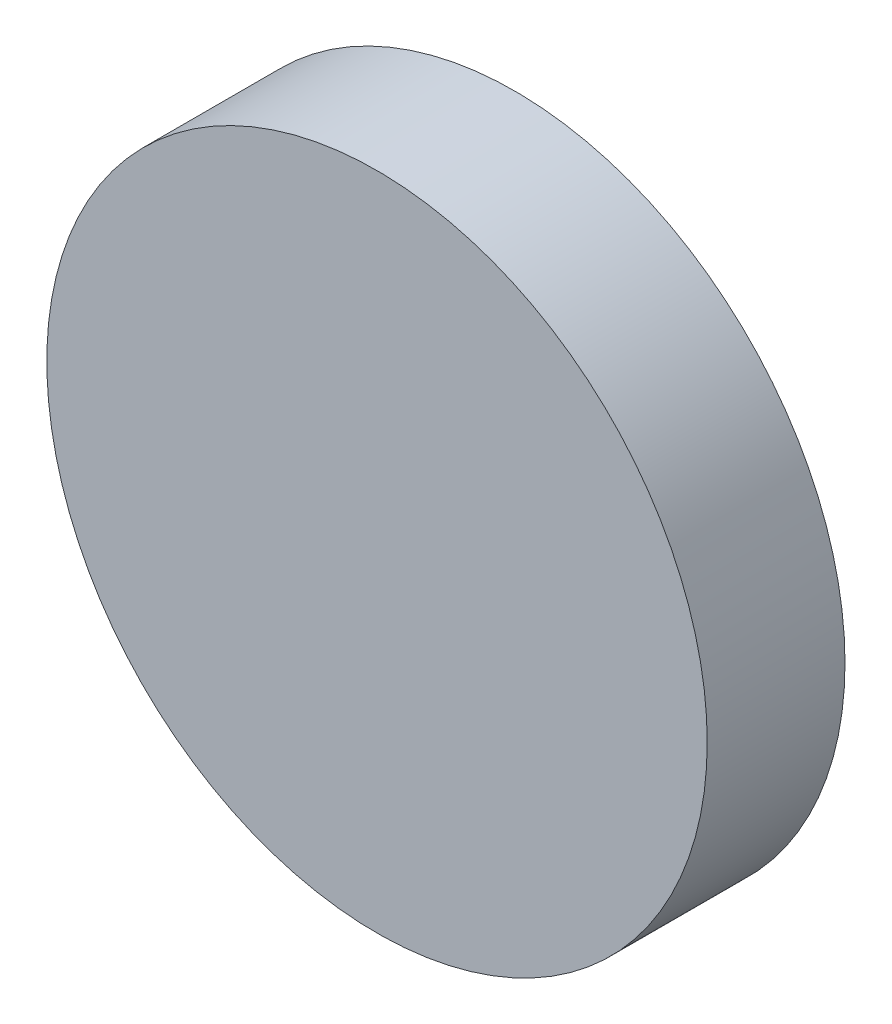
ISO-10303-21;
HEADER;
FILE_DESCRIPTION(('STEP AP214'),'2;1');
FILE_NAME('part.step','',(''),(''),'','','');
FILE_SCHEMA(('AUTOMOTIVE_DESIGN { 1 0 10303 214 1 1 1 1 }'));
ENDSEC;
DATA;
#1=APPLICATION_CONTEXT('core data for automotive mechanical design processes');
#2=APPLICATION_PROTOCOL_DEFINITION('international standard','automotive_design',2000,#1);
#3=PRODUCT_CONTEXT('',#1,'mechanical');
#4=PRODUCT('Part','Part','',(#3));
#5=PRODUCT_RELATED_PRODUCT_CATEGORY('part','',(#4));
#6=PRODUCT_DEFINITION_FORMATION('','',#4);
#7=PRODUCT_DEFINITION_CONTEXT('part definition',#1,'design');
#8=PRODUCT_DEFINITION('design','',#6,#7);
#9=PRODUCT_DEFINITION_SHAPE('','',#8);
#10=(LENGTH_UNIT() NAMED_UNIT(*) SI_UNIT(.MILLI.,.METRE.));
#11=(NAMED_UNIT(*) PLANE_ANGLE_UNIT() SI_UNIT($,.RADIAN.));
#12=(NAMED_UNIT(*) SI_UNIT($,.STERADIAN.) SOLID_ANGLE_UNIT());
#13=UNCERTAINTY_MEASURE_WITH_UNIT(LENGTH_MEASURE(1.E-05),#10,'distance_accuracy_value','');
#14=(GEOMETRIC_REPRESENTATION_CONTEXT(3) GLOBAL_UNCERTAINTY_ASSIGNED_CONTEXT((#13)) GLOBAL_UNIT_ASSIGNED_CONTEXT((#10,
#11,#12)) REPRESENTATION_CONTEXT('',''));
#15=CARTESIAN_POINT('',(0.,0.,0.));
#16=DIRECTION('',(0.,0.,1.));
#17=DIRECTION('',(1.,0.,0.));
#18=AXIS2_PLACEMENT_3D('',#15,#16,#17);
#19=CARTESIAN_POINT('',(-63.2639429290524,46.1363070539419,40.));
#20=DIRECTION('',(0.,0.,-1.));
#21=DIRECTION('',(-1.,0.,0.));
#22=AXIS2_PLACEMENT_3D('',#19,#20,#21);
#23=CYLINDRICAL_SURFACE('',#22,95.8704325671782);
#24=CARTESIAN_POINT('',(-63.2639429290524,46.1363070539419,40.));
#25=DIRECTION('',(0.,0.,1.));
#26=DIRECTION('',(1.,0.,0.));
#27=AXIS2_PLACEMENT_3D('',#24,#25,#26);
#28=CIRCLE('',#27,95.8704325671782);
#29=CARTESIAN_POINT('',(32.6064896381258,46.1363070539419,40.));
#30=VERTEX_POINT('',#29);
#31=EDGE_CURVE('E10',#30,#30,#28,.T.);
#32=ORIENTED_EDGE('',*,*,#31,.F.);
#33=EDGE_LOOP('',(#32));
#34=FACE_BOUND('',#33,.T.);
#35=CARTESIAN_POINT('',(-63.2639429290524,46.1363070539419,0.));
#36=DIRECTION('',(0.,0.,1.));
#37=DIRECTION('',(1.,0.,0.));
#38=AXIS2_PLACEMENT_3D('',#35,#36,#37);
#39=CIRCLE('',#38,95.8704325671782);
#40=CARTESIAN_POINT('',(32.6064896381258,46.1363070539419,0.));
#41=VERTEX_POINT('',#40);
#42=EDGE_CURVE('E32',#41,#41,#39,.T.);
#43=ORIENTED_EDGE('',*,*,#42,.T.);
#44=EDGE_LOOP('',(#43));
#45=FACE_BOUND('',#44,.T.);
#46=ADVANCED_FACE('F29',(#34,#45),#23,.T.);
#47=CARTESIAN_POINT('',(-63.2639429290524,46.1363070539419,40.));
#48=DIRECTION('',(0.,0.,1.));
#49=DIRECTION('',(1.,0.,0.));
#50=AXIS2_PLACEMENT_3D('',#47,#48,#49);
#51=PLANE('',#50);
#52=ORIENTED_EDGE('',*,*,#31,.T.);
#53=EDGE_LOOP('',(#52));
#54=FACE_BOUND('',#53,.T.);
#55=ADVANCED_FACE('F44',(#54),#51,.T.);
#56=CARTESIAN_POINT('',(-63.2639429290524,46.1363070539419,0.));
#57=DIRECTION('',(0.,0.,1.));
#58=DIRECTION('',(1.,0.,0.));
#59=AXIS2_PLACEMENT_3D('',#56,#57,#58);
#60=PLANE('',#59);
#61=ORIENTED_EDGE('',*,*,#42,.F.);
#62=EDGE_LOOP('',(#61));
#63=FACE_BOUND('',#62,.T.);
#64=ADVANCED_FACE('F42',(#63),#60,.F.);
#65=CLOSED_SHELL('',(#46,#55,#64));
#66=MANIFOLD_SOLID_BREP('B2',#65);
#67=ADVANCED_BREP_SHAPE_REPRESENTATION('',(#18,#66),#14);
#68=SHAPE_DEFINITION_REPRESENTATION(#9,#67);
ENDSEC;
END-ISO-10303-21;
